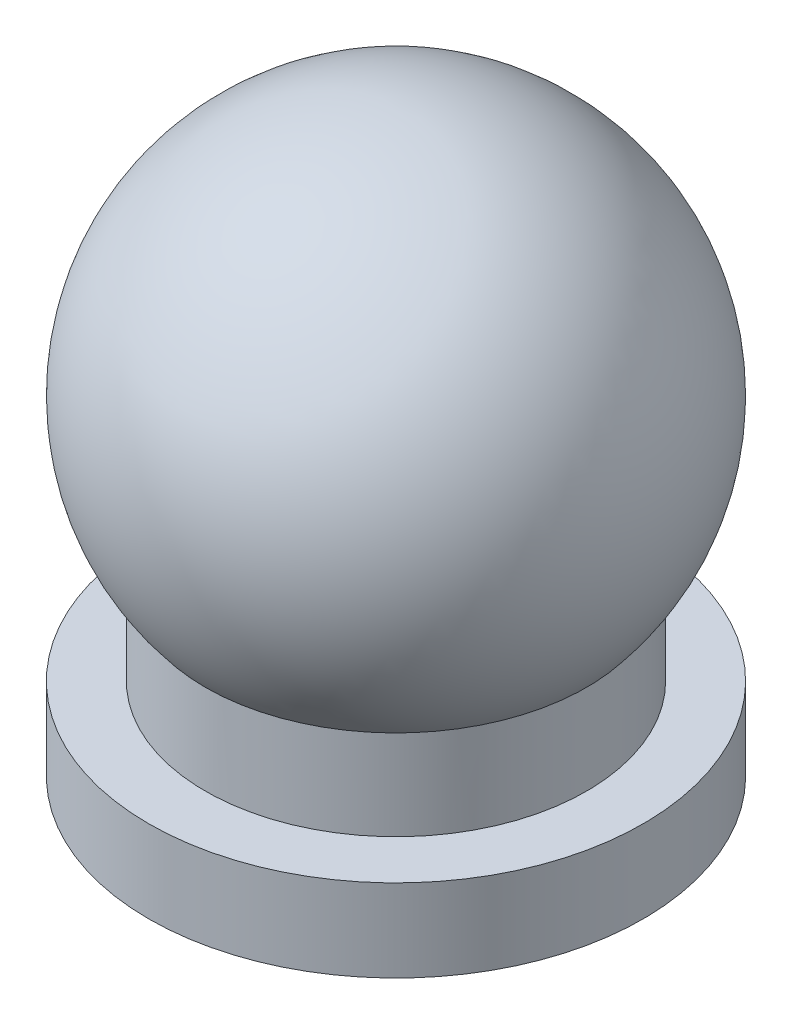
ISO-10303-21;
HEADER;
FILE_DESCRIPTION(('STEP AP214'),'2;1');
FILE_NAME('part.step','',(''),(''),'','','');
FILE_SCHEMA(('AUTOMOTIVE_DESIGN { 1 0 10303 214 1 1 1 1 }'));
ENDSEC;
DATA;
#1=APPLICATION_CONTEXT('core data for automotive mechanical design processes');
#2=APPLICATION_PROTOCOL_DEFINITION('international standard','automotive_design',2000,#1);
#3=PRODUCT_CONTEXT('',#1,'mechanical');
#4=PRODUCT('Part','Part','',(#3));
#5=PRODUCT_RELATED_PRODUCT_CATEGORY('part','',(#4));
#6=PRODUCT_DEFINITION_FORMATION('','',#4);
#7=PRODUCT_DEFINITION_CONTEXT('part definition',#1,'design');
#8=PRODUCT_DEFINITION('design','',#6,#7);
#9=PRODUCT_DEFINITION_SHAPE('','',#8);
#10=(LENGTH_UNIT() NAMED_UNIT(*) SI_UNIT(.MILLI.,.METRE.));
#11=(NAMED_UNIT(*) PLANE_ANGLE_UNIT() SI_UNIT($,.RADIAN.));
#12=(NAMED_UNIT(*) SI_UNIT($,.STERADIAN.) SOLID_ANGLE_UNIT());
#13=UNCERTAINTY_MEASURE_WITH_UNIT(LENGTH_MEASURE(1.E-05),#10,'distance_accuracy_value','');
#14=(GEOMETRIC_REPRESENTATION_CONTEXT(3) GLOBAL_UNCERTAINTY_ASSIGNED_CONTEXT((#13)) GLOBAL_UNIT_ASSIGNED_CONTEXT((#10,
#11,#12)) REPRESENTATION_CONTEXT('',''));
#15=CARTESIAN_POINT('',(0.,0.,0.));
#16=DIRECTION('',(0.,0.,1.));
#17=DIRECTION('',(1.,0.,0.));
#18=AXIS2_PLACEMENT_3D('',#15,#16,#17);
#19=CARTESIAN_POINT('',(0.,1.,0.));
#20=DIRECTION('',(0.,-1.,0.));
#21=DIRECTION('',(0.,0.,-1.));
#22=AXIS2_PLACEMENT_3D('',#19,#20,#21);
#23=CYLINDRICAL_SURFACE('',#22,3.);
#24=CARTESIAN_POINT('',(0.,1.,0.));
#25=DIRECTION('',(0.,1.,0.));
#26=DIRECTION('',(0.,0.,1.));
#27=AXIS2_PLACEMENT_3D('',#24,#25,#26);
#28=CIRCLE('',#27,3.);
#29=CARTESIAN_POINT('',(0.,1.,3.));
#30=VERTEX_POINT('',#29);
#31=EDGE_CURVE('E10',#30,#30,#28,.T.);
#32=ORIENTED_EDGE('',*,*,#31,.F.);
#33=EDGE_LOOP('',(#32));
#34=FACE_BOUND('',#33,.T.);
#35=CARTESIAN_POINT('',(0.,0.,0.));
#36=DIRECTION('',(0.,1.,0.));
#37=DIRECTION('',(0.,0.,1.));
#38=AXIS2_PLACEMENT_3D('',#35,#36,#37);
#39=CIRCLE('',#38,3.);
#40=CARTESIAN_POINT('',(0.,0.,3.));
#41=VERTEX_POINT('',#40);
#42=EDGE_CURVE('E40',#41,#41,#39,.T.);
#43=ORIENTED_EDGE('',*,*,#42,.T.);
#44=EDGE_LOOP('',(#43));
#45=FACE_BOUND('',#44,.T.);
#46=ADVANCED_FACE('F37',(#34,#45),#23,.T.);
#47=CARTESIAN_POINT('',(0.,1.,0.));
#48=DIRECTION('',(0.,1.,0.));
#49=DIRECTION('',(0.,0.,1.));
#50=AXIS2_PLACEMENT_3D('',#47,#48,#49);
#51=PLANE('',#50);
#52=CARTESIAN_POINT('',(0.,1.,0.));
#53=DIRECTION('',(0.,-1.,0.));
#54=DIRECTION('',(0.,0.,-1.));
#55=AXIS2_PLACEMENT_3D('',#52,#53,#54);
#56=CIRCLE('',#55,2.31383963844184);
#57=CARTESIAN_POINT('',(0.,1.,-2.31383963844184));
#58=VERTEX_POINT('',#57);
#59=EDGE_CURVE('E51',#58,#58,#56,.T.);
#60=ORIENTED_EDGE('',*,*,#59,.T.);
#61=EDGE_LOOP('',(#60));
#62=FACE_BOUND('',#61,.T.);
#63=ORIENTED_EDGE('',*,*,#31,.T.);
#64=EDGE_LOOP('',(#63));
#65=FACE_BOUND('',#64,.T.);
#66=ADVANCED_FACE('F74',(#62,#65),#51,.T.);
#67=CARTESIAN_POINT('',(0.,0.,0.));
#68=DIRECTION('',(0.,1.,0.));
#69=DIRECTION('',(0.,0.,1.));
#70=AXIS2_PLACEMENT_3D('',#67,#68,#69);
#71=PLANE('',#70);
#72=CARTESIAN_POINT('',(0.,0.,0.));
#73=DIRECTION('',(0.,-1.,0.));
#74=DIRECTION('',(0.,0.,-1.));
#75=AXIS2_PLACEMENT_3D('',#72,#73,#74);
#76=CIRCLE('',#75,1.5);
#77=CARTESIAN_POINT('',(0.,0.,-1.5));
#78=VERTEX_POINT('',#77);
#79=EDGE_CURVE('E55',#78,#78,#76,.T.);
#80=ORIENTED_EDGE('',*,*,#79,.F.);
#81=EDGE_LOOP('',(#80));
#82=FACE_BOUND('',#81,.T.);
#83=ORIENTED_EDGE('',*,*,#42,.F.);
#84=EDGE_LOOP('',(#83));
#85=FACE_BOUND('',#84,.T.);
#86=ADVANCED_FACE('F70',(#82,#85),#71,.F.);
#87=CARTESIAN_POINT('',(0.,4.,0.));
#88=DIRECTION('',(0.,-1.,0.));
#89=DIRECTION('',(0.,0.,1.));
#90=AXIS2_PLACEMENT_3D('',#87,#88,#89);
#91=SPHERICAL_SURFACE('',#90,3.);
#92=CARTESIAN_POINT('',(0.,2.09051155343235,0.));
#93=DIRECTION('',(0.,-1.,0.));
#94=DIRECTION('',(0.,0.,-1.));
#95=AXIS2_PLACEMENT_3D('',#92,#93,#94);
#96=CIRCLE('',#95,2.31383963844184);
#97=CARTESIAN_POINT('',(0.,2.09051155343235,-2.31383963844184));
#98=VERTEX_POINT('',#97);
#99=EDGE_CURVE('E47',#98,#98,#96,.T.);
#100=ORIENTED_EDGE('',*,*,#99,.F.);
#101=EDGE_LOOP('',(#100));
#102=FACE_BOUND('',#101,.T.);
#103=ADVANCED_FACE('F73',(#102),#91,.T.);
#104=CARTESIAN_POINT('',(0.,4.,0.));
#105=DIRECTION('',(0.,-1.,0.));
#106=DIRECTION('',(0.,0.,-1.));
#107=AXIS2_PLACEMENT_3D('',#104,#105,#106);
#108=CYLINDRICAL_SURFACE('',#107,2.31383963844184);
#109=ORIENTED_EDGE('',*,*,#59,.F.);
#110=EDGE_LOOP('',(#109));
#111=FACE_BOUND('',#110,.T.);
#112=ORIENTED_EDGE('',*,*,#99,.T.);
#113=EDGE_LOOP('',(#112));
#114=FACE_BOUND('',#113,.T.);
#115=ADVANCED_FACE('F66',(#111,#114),#108,.T.);
#116=CARTESIAN_POINT('',(0.,5.5,0.));
#117=DIRECTION('',(0.,-1.,0.));
#118=DIRECTION('',(0.,0.,-1.));
#119=AXIS2_PLACEMENT_3D('',#116,#117,#118);
#120=CYLINDRICAL_SURFACE('',#119,1.5);
#121=CARTESIAN_POINT('',(0.,5.5,0.));
#122=DIRECTION('',(0.,-1.,0.));
#123=DIRECTION('',(0.,0.,-1.));
#124=AXIS2_PLACEMENT_3D('',#121,#122,#123);
#125=CIRCLE('',#124,1.5);
#126=CARTESIAN_POINT('',(0.,5.5,-1.5));
#127=VERTEX_POINT('',#126);
#128=EDGE_CURVE('E54',#127,#127,#125,.T.);
#129=ORIENTED_EDGE('',*,*,#128,.F.);
#130=EDGE_LOOP('',(#129));
#131=FACE_BOUND('',#130,.T.);
#132=ORIENTED_EDGE('',*,*,#79,.T.);
#133=EDGE_LOOP('',(#132));
#134=FACE_BOUND('',#133,.T.);
#135=ADVANCED_FACE('F63',(#131,#134),#120,.F.);
#136=CARTESIAN_POINT('',(0.,5.5,0.));
#137=DIRECTION('',(0.,-1.,0.));
#138=DIRECTION('',(0.,0.,-1.));
#139=AXIS2_PLACEMENT_3D('',#136,#137,#138);
#140=PLANE('',#139);
#141=ORIENTED_EDGE('',*,*,#128,.T.);
#142=EDGE_LOOP('',(#141));
#143=FACE_BOUND('',#142,.T.);
#144=ADVANCED_FACE('F61',(#143),#140,.T.);
#145=CLOSED_SHELL('',(#46,#66,#86,#103,#115,#135,#144));
#146=MANIFOLD_SOLID_BREP('B2',#145);
#147=ADVANCED_BREP_SHAPE_REPRESENTATION('',(#18,#146),#14);
#148=SHAPE_DEFINITION_REPRESENTATION(#9,#147);
ENDSEC;
END-ISO-10303-21;
